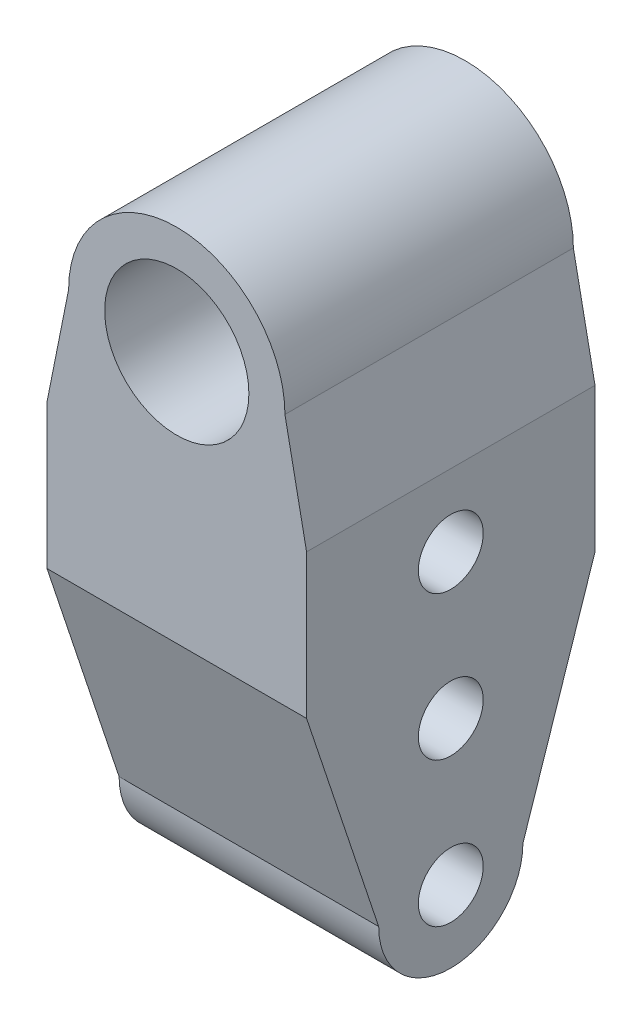
ISO-10303-21;
HEADER;
FILE_DESCRIPTION(('STEP AP214'),'2;1');
FILE_NAME('part.step','',(''),(''),'','','');
FILE_SCHEMA(('AUTOMOTIVE_DESIGN { 1 0 10303 214 1 1 1 1 }'));
ENDSEC;
DATA;
#1=APPLICATION_CONTEXT('core data for automotive mechanical design processes');
#2=APPLICATION_PROTOCOL_DEFINITION('international standard','automotive_design',2000,#1);
#3=PRODUCT_CONTEXT('',#1,'mechanical');
#4=PRODUCT('Part','Part','',(#3));
#5=PRODUCT_RELATED_PRODUCT_CATEGORY('part','',(#4));
#6=PRODUCT_DEFINITION_FORMATION('','',#4);
#7=PRODUCT_DEFINITION_CONTEXT('part definition',#1,'design');
#8=PRODUCT_DEFINITION('design','',#6,#7);
#9=PRODUCT_DEFINITION_SHAPE('','',#8);
#10=(LENGTH_UNIT() NAMED_UNIT(*) SI_UNIT(.MILLI.,.METRE.));
#11=(NAMED_UNIT(*) PLANE_ANGLE_UNIT() SI_UNIT($,.RADIAN.));
#12=(NAMED_UNIT(*) SI_UNIT($,.STERADIAN.) SOLID_ANGLE_UNIT());
#13=UNCERTAINTY_MEASURE_WITH_UNIT(LENGTH_MEASURE(1.E-05),#10,'distance_accuracy_value','');
#14=(GEOMETRIC_REPRESENTATION_CONTEXT(3) GLOBAL_UNCERTAINTY_ASSIGNED_CONTEXT((#13)) GLOBAL_UNIT_ASSIGNED_CONTEXT((#10,
#11,#12)) REPRESENTATION_CONTEXT('',''));
#15=CARTESIAN_POINT('',(0.,0.,0.));
#16=DIRECTION('',(0.,0.,1.));
#17=DIRECTION('',(1.,0.,0.));
#18=AXIS2_PLACEMENT_3D('',#15,#16,#17);
#19=CARTESIAN_POINT('',(18.,-75.,20.));
#20=DIRECTION('',(-1.,0.,0.));
#21=DIRECTION('',(0.,-1.,0.));
#22=AXIS2_PLACEMENT_3D('',#19,#20,#21);
#23=PLANE('',#22);
#24=CARTESIAN_POINT('',(18.,-25.,0.));
#25=DIRECTION('',(-1.,0.,0.));
#26=DIRECTION('',(0.,-1.,0.));
#27=AXIS2_PLACEMENT_3D('',#24,#25,#26);
#28=CIRCLE('',#27,4.5);
#29=CARTESIAN_POINT('',(18.,-29.5,0.));
#30=VERTEX_POINT('',#29);
#31=EDGE_CURVE('E136',#30,#30,#28,.T.);
#32=ORIENTED_EDGE('',*,*,#31,.T.);
#33=EDGE_LOOP('',(#32));
#34=FACE_BOUND('',#33,.T.);
#35=CARTESIAN_POINT('',(18.,-45.,0.));
#36=DIRECTION('',(-1.,0.,0.));
#37=DIRECTION('',(0.,-1.,0.));
#38=AXIS2_PLACEMENT_3D('',#35,#36,#37);
#39=CIRCLE('',#38,4.5);
#40=CARTESIAN_POINT('',(18.,-49.5,0.));
#41=VERTEX_POINT('',#40);
#42=EDGE_CURVE('E137',#41,#41,#39,.T.);
#43=ORIENTED_EDGE('',*,*,#42,.T.);
#44=EDGE_LOOP('',(#43));
#45=FACE_BOUND('',#44,.T.);
#46=CARTESIAN_POINT('',(18.,-65.,0.));
#47=DIRECTION('',(-1.,0.,0.));
#48=DIRECTION('',(0.,-1.,0.));
#49=AXIS2_PLACEMENT_3D('',#46,#47,#48);
#50=CIRCLE('',#49,4.5);
#51=CARTESIAN_POINT('',(18.,-69.5,0.));
#52=VERTEX_POINT('',#51);
#53=EDGE_CURVE('E141',#52,#52,#50,.T.);
#54=ORIENTED_EDGE('',*,*,#53,.T.);
#55=EDGE_LOOP('',(#54));
#56=FACE_BOUND('',#55,.T.);
#57=DIRECTION('',(0.,0.948683298050514,0.316227766016838));
#58=VECTOR('',#57,1.);
#59=CARTESIAN_POINT('',(18.,-71.,8.));
#60=LINE('',#59,#58);
#61=CARTESIAN_POINT('',(18.,-65.,10.));
#62=VERTEX_POINT('',#61);
#63=CARTESIAN_POINT('',(18.,-35.,20.));
#64=VERTEX_POINT('',#63);
#65=EDGE_CURVE('E144',#62,#64,#60,.T.);
#66=ORIENTED_EDGE('',*,*,#65,.F.);
#67=CARTESIAN_POINT('',(18.,-65.,0.));
#68=DIRECTION('',(-1.,0.,0.));
#69=DIRECTION('',(0.,-1.,0.));
#70=AXIS2_PLACEMENT_3D('',#67,#68,#69);
#71=CIRCLE('',#70,10.);
#72=CARTESIAN_POINT('',(18.,-65.0000000000001,-9.99999999999999));
#73=VERTEX_POINT('',#72);
#74=EDGE_CURVE('E52',#73,#62,#71,.T.);
#75=ORIENTED_EDGE('',*,*,#74,.F.);
#76=DIRECTION('',(0.,-0.948683298050514,0.316227766016838));
#77=VECTOR('',#76,1.);
#78=CARTESIAN_POINT('',(18.,-83.,-4.));
#79=LINE('',#78,#77);
#80=CARTESIAN_POINT('',(18.,-35.,-20.));
#81=VERTEX_POINT('',#80);
#82=EDGE_CURVE('E183',#81,#73,#79,.T.);
#83=ORIENTED_EDGE('',*,*,#82,.F.);
#84=DIRECTION('',(0.,1.,0.));
#85=VECTOR('',#84,1.);
#86=CARTESIAN_POINT('',(18.,-75.,-20.));
#87=LINE('',#86,#85);
#88=CARTESIAN_POINT('',(18.,-15.,-20.));
#89=VERTEX_POINT('',#88);
#90=EDGE_CURVE('E121',#81,#89,#87,.T.);
#91=ORIENTED_EDGE('',*,*,#90,.T.);
#92=DIRECTION('',(0.,0.,-1.));
#93=VECTOR('',#92,1.);
#94=CARTESIAN_POINT('',(18.,-15.,20.));
#95=LINE('',#94,#93);
#96=CARTESIAN_POINT('',(18.,-15.,20.));
#97=VERTEX_POINT('',#96);
#98=EDGE_CURVE('E127',#97,#89,#95,.T.);
#99=ORIENTED_EDGE('',*,*,#98,.F.);
#100=DIRECTION('',(0.,1.,0.));
#101=VECTOR('',#100,1.);
#102=CARTESIAN_POINT('',(18.,-75.,20.));
#103=LINE('',#102,#101);
#104=EDGE_CURVE('E112',#64,#97,#103,.T.);
#105=ORIENTED_EDGE('',*,*,#104,.F.);
#106=EDGE_LOOP('',(#66,#75,#83,#91,#99,#105));
#107=FACE_BOUND('',#106,.T.);
#108=ADVANCED_FACE('F38',(#34,#45,#56,#107),#23,.F.);
#109=CARTESIAN_POINT('',(-18.,-75.,20.));
#110=DIRECTION('',(1.,0.,0.));
#111=DIRECTION('',(0.,0.,-1.));
#112=AXIS2_PLACEMENT_3D('',#109,#110,#111);
#113=PLANE('',#112);
#114=CARTESIAN_POINT('',(-18.,-25.,0.));
#115=DIRECTION('',(1.,0.,0.));
#116=DIRECTION('',(0.,0.,-1.));
#117=AXIS2_PLACEMENT_3D('',#114,#115,#116);
#118=CIRCLE('',#117,4.5);
#119=CARTESIAN_POINT('',(-18.,-25.,-4.5));
#120=VERTEX_POINT('',#119);
#121=EDGE_CURVE('E133',#120,#120,#118,.T.);
#122=ORIENTED_EDGE('',*,*,#121,.T.);
#123=EDGE_LOOP('',(#122));
#124=FACE_BOUND('',#123,.T.);
#125=CARTESIAN_POINT('',(-18.,-45.,0.));
#126=DIRECTION('',(1.,0.,0.));
#127=DIRECTION('',(0.,0.,-1.));
#128=AXIS2_PLACEMENT_3D('',#125,#126,#127);
#129=CIRCLE('',#128,4.5);
#130=CARTESIAN_POINT('',(-18.,-45.,-4.5));
#131=VERTEX_POINT('',#130);
#132=EDGE_CURVE('E138',#131,#131,#129,.T.);
#133=ORIENTED_EDGE('',*,*,#132,.T.);
#134=EDGE_LOOP('',(#133));
#135=FACE_BOUND('',#134,.T.);
#136=CARTESIAN_POINT('',(-18.,-65.,0.));
#137=DIRECTION('',(1.,0.,0.));
#138=DIRECTION('',(0.,0.,-1.));
#139=AXIS2_PLACEMENT_3D('',#136,#137,#138);
#140=CIRCLE('',#139,4.5);
#141=CARTESIAN_POINT('',(-18.,-65.,-4.5));
#142=VERTEX_POINT('',#141);
#143=EDGE_CURVE('E142',#142,#142,#140,.T.);
#144=ORIENTED_EDGE('',*,*,#143,.T.);
#145=EDGE_LOOP('',(#144));
#146=FACE_BOUND('',#145,.T.);
#147=DIRECTION('',(0.,-0.948683298050514,-0.316227766016838));
#148=VECTOR('',#147,1.);
#149=CARTESIAN_POINT('',(-18.,-71.,8.));
#150=LINE('',#149,#148);
#151=CARTESIAN_POINT('',(-18.,-35.,20.));
#152=VERTEX_POINT('',#151);
#153=CARTESIAN_POINT('',(-18.,-65.,10.));
#154=VERTEX_POINT('',#153);
#155=EDGE_CURVE('E11',#152,#154,#150,.T.);
#156=ORIENTED_EDGE('',*,*,#155,.F.);
#157=DIRECTION('',(0.,-1.,0.));
#158=VECTOR('',#157,1.);
#159=CARTESIAN_POINT('',(-18.,-75.,20.));
#160=LINE('',#159,#158);
#161=CARTESIAN_POINT('',(-18.,-15.,20.));
#162=VERTEX_POINT('',#161);
#163=EDGE_CURVE('E151',#162,#152,#160,.T.);
#164=ORIENTED_EDGE('',*,*,#163,.F.);
#165=DIRECTION('',(0.,0.,-1.));
#166=VECTOR('',#165,1.);
#167=CARTESIAN_POINT('',(-18.,-15.,20.));
#168=LINE('',#167,#166);
#169=CARTESIAN_POINT('',(-18.,-15.,-20.));
#170=VERTEX_POINT('',#169);
#171=EDGE_CURVE('E109',#162,#170,#168,.T.);
#172=ORIENTED_EDGE('',*,*,#171,.T.);
#173=DIRECTION('',(0.,-1.,0.));
#174=VECTOR('',#173,1.);
#175=CARTESIAN_POINT('',(-18.,-75.,-20.));
#176=LINE('',#175,#174);
#177=CARTESIAN_POINT('',(-18.,-35.,-20.));
#178=VERTEX_POINT('',#177);
#179=EDGE_CURVE('E101',#170,#178,#176,.T.);
#180=ORIENTED_EDGE('',*,*,#179,.T.);
#181=DIRECTION('',(0.,0.948683298050514,-0.316227766016838));
#182=VECTOR('',#181,1.);
#183=CARTESIAN_POINT('',(-18.,-83.,-4.));
#184=LINE('',#183,#182);
#185=CARTESIAN_POINT('',(-18.,-65.0000000000001,-9.99999999999999));
#186=VERTEX_POINT('',#185);
#187=EDGE_CURVE('E105',#186,#178,#184,.T.);
#188=ORIENTED_EDGE('',*,*,#187,.F.);
#189=CARTESIAN_POINT('',(-18.,-65.,0.));
#190=DIRECTION('',(1.,0.,0.));
#191=DIRECTION('',(0.,0.,-1.));
#192=AXIS2_PLACEMENT_3D('',#189,#190,#191);
#193=CIRCLE('',#192,10.);
#194=EDGE_CURVE('E45',#154,#186,#193,.T.);
#195=ORIENTED_EDGE('',*,*,#194,.F.);
#196=EDGE_LOOP('',(#156,#164,#172,#180,#188,#195));
#197=FACE_BOUND('',#196,.T.);
#198=ADVANCED_FACE('F103',(#124,#135,#146,#197),#113,.F.);
#199=CARTESIAN_POINT('',(0.,0.,20.));
#200=DIRECTION('',(0.,0.,1.));
#201=DIRECTION('',(1.,0.,0.));
#202=AXIS2_PLACEMENT_3D('',#199,#200,#201);
#203=PLANE('',#202);
#204=DIRECTION('',(-1.,0.,0.));
#205=VECTOR('',#204,1.);
#206=CARTESIAN_POINT('',(149.077267289183,-35.,20.));
#207=LINE('',#206,#205);
#208=EDGE_CURVE('E185',#64,#152,#207,.T.);
#209=ORIENTED_EDGE('',*,*,#208,.F.);
#210=ORIENTED_EDGE('',*,*,#104,.T.);
#211=DIRECTION('',(-0.196116135138184,0.98058067569092,0.));
#212=VECTOR('',#211,1.);
#213=CARTESIAN_POINT('',(18.,-15.,20.));
#214=LINE('',#213,#212);
#215=CARTESIAN_POINT('',(15.,0.,20.));
#216=VERTEX_POINT('',#215);
#217=EDGE_CURVE('E166',#97,#216,#214,.T.);
#218=ORIENTED_EDGE('',*,*,#217,.T.);
#219=CARTESIAN_POINT('',(0.,0.,20.));
#220=DIRECTION('',(0.,0.,1.));
#221=DIRECTION('',(1.,0.,0.));
#222=AXIS2_PLACEMENT_3D('',#219,#220,#221);
#223=CIRCLE('',#222,15.);
#224=CARTESIAN_POINT('',(-15.,0.,20.));
#225=VERTEX_POINT('',#224);
#226=EDGE_CURVE('E164',#216,#225,#223,.T.);
#227=ORIENTED_EDGE('',*,*,#226,.T.);
#228=DIRECTION('',(-0.196116135138184,-0.98058067569092,0.));
#229=VECTOR('',#228,1.);
#230=CARTESIAN_POINT('',(-18.,-15.,20.));
#231=LINE('',#230,#229);
#232=EDGE_CURVE('E162',#225,#162,#231,.T.);
#233=ORIENTED_EDGE('',*,*,#232,.T.);
#234=ORIENTED_EDGE('',*,*,#163,.T.);
#235=EDGE_LOOP('',(#209,#210,#218,#227,#233,#234));
#236=FACE_BOUND('',#235,.T.);
#237=CARTESIAN_POINT('',(0.,0.,20.));
#238=DIRECTION('',(0.,0.,1.));
#239=DIRECTION('',(1.,0.,0.));
#240=AXIS2_PLACEMENT_3D('',#237,#238,#239);
#241=CIRCLE('',#240,10.);
#242=CARTESIAN_POINT('',(10.,0.,20.));
#243=VERTEX_POINT('',#242);
#244=EDGE_CURVE('E159',#243,#243,#241,.T.);
#245=ORIENTED_EDGE('',*,*,#244,.F.);
#246=EDGE_LOOP('',(#245));
#247=FACE_BOUND('',#246,.T.);
#248=ADVANCED_FACE('F195',(#236,#247),#203,.T.);
#249=CARTESIAN_POINT('',(0.,0.,-20.));
#250=DIRECTION('',(0.,0.,1.));
#251=DIRECTION('',(1.,0.,0.));
#252=AXIS2_PLACEMENT_3D('',#249,#250,#251);
#253=PLANE('',#252);
#254=ORIENTED_EDGE('',*,*,#90,.F.);
#255=DIRECTION('',(-1.,0.,0.));
#256=VECTOR('',#255,1.);
#257=CARTESIAN_POINT('',(149.077267289183,-35.,-20.));
#258=LINE('',#257,#256);
#259=EDGE_CURVE('E117',#81,#178,#258,.T.);
#260=ORIENTED_EDGE('',*,*,#259,.T.);
#261=ORIENTED_EDGE('',*,*,#179,.F.);
#262=DIRECTION('',(-0.196116135138184,-0.98058067569092,0.));
#263=VECTOR('',#262,1.);
#264=CARTESIAN_POINT('',(-18.,-15.,-20.));
#265=LINE('',#264,#263);
#266=CARTESIAN_POINT('',(-15.,0.,-20.));
#267=VERTEX_POINT('',#266);
#268=EDGE_CURVE('E113',#267,#170,#265,.T.);
#269=ORIENTED_EDGE('',*,*,#268,.F.);
#270=CARTESIAN_POINT('',(0.,0.,-20.));
#271=DIRECTION('',(0.,0.,1.));
#272=DIRECTION('',(1.,0.,0.));
#273=AXIS2_PLACEMENT_3D('',#270,#271,#272);
#274=CIRCLE('',#273,15.);
#275=CARTESIAN_POINT('',(15.,0.,-20.));
#276=VERTEX_POINT('',#275);
#277=EDGE_CURVE('E154',#276,#267,#274,.T.);
#278=ORIENTED_EDGE('',*,*,#277,.F.);
#279=DIRECTION('',(-0.196116135138184,0.98058067569092,0.));
#280=VECTOR('',#279,1.);
#281=CARTESIAN_POINT('',(18.,-15.,-20.));
#282=LINE('',#281,#280);
#283=EDGE_CURVE('E156',#89,#276,#282,.T.);
#284=ORIENTED_EDGE('',*,*,#283,.F.);
#285=EDGE_LOOP('',(#254,#260,#261,#269,#278,#284));
#286=FACE_BOUND('',#285,.T.);
#287=CARTESIAN_POINT('',(0.,0.,-20.));
#288=DIRECTION('',(0.,0.,1.));
#289=DIRECTION('',(1.,0.,0.));
#290=AXIS2_PLACEMENT_3D('',#287,#288,#289);
#291=CIRCLE('',#290,10.);
#292=CARTESIAN_POINT('',(10.,0.,-20.));
#293=VERTEX_POINT('',#292);
#294=EDGE_CURVE('E169',#293,#293,#291,.T.);
#295=ORIENTED_EDGE('',*,*,#294,.T.);
#296=EDGE_LOOP('',(#295));
#297=FACE_BOUND('',#296,.T.);
#298=ADVANCED_FACE('F118',(#286,#297),#253,.F.);
#299=CARTESIAN_POINT('',(18.,-15.,20.));
#300=DIRECTION('',(-0.98058067569092,-0.196116135138184,0.));
#301=DIRECTION('',(0.196116135138184,-0.98058067569092,0.));
#302=AXIS2_PLACEMENT_3D('',#299,#300,#301);
#303=PLANE('',#302);
#304=ORIENTED_EDGE('',*,*,#283,.T.);
#305=DIRECTION('',(0.,0.,-1.));
#306=VECTOR('',#305,1.);
#307=CARTESIAN_POINT('',(15.,0.,20.));
#308=LINE('',#307,#306);
#309=EDGE_CURVE('E130',#216,#276,#308,.T.);
#310=ORIENTED_EDGE('',*,*,#309,.F.);
#311=ORIENTED_EDGE('',*,*,#217,.F.);
#312=ORIENTED_EDGE('',*,*,#98,.T.);
#313=EDGE_LOOP('',(#304,#310,#311,#312));
#314=FACE_BOUND('',#313,.T.);
#315=ADVANCED_FACE('F209',(#314),#303,.F.);
#316=CARTESIAN_POINT('',(0.,0.,20.));
#317=DIRECTION('',(0.,0.,-1.));
#318=DIRECTION('',(-1.,0.,0.));
#319=AXIS2_PLACEMENT_3D('',#316,#317,#318);
#320=CYLINDRICAL_SURFACE('',#319,15.);
#321=ORIENTED_EDGE('',*,*,#277,.T.);
#322=DIRECTION('',(0.,0.,-1.));
#323=VECTOR('',#322,1.);
#324=CARTESIAN_POINT('',(-15.,0.,20.));
#325=LINE('',#324,#323);
#326=EDGE_CURVE('E148',#225,#267,#325,.T.);
#327=ORIENTED_EDGE('',*,*,#326,.F.);
#328=ORIENTED_EDGE('',*,*,#226,.F.);
#329=ORIENTED_EDGE('',*,*,#309,.T.);
#330=EDGE_LOOP('',(#321,#327,#328,#329));
#331=FACE_BOUND('',#330,.T.);
#332=ADVANCED_FACE('F205',(#331),#320,.T.);
#333=CARTESIAN_POINT('',(-18.,-15.,20.));
#334=DIRECTION('',(0.98058067569092,-0.196116135138184,0.));
#335=DIRECTION('',(0.196116135138184,0.98058067569092,0.));
#336=AXIS2_PLACEMENT_3D('',#333,#334,#335);
#337=PLANE('',#336);
#338=ORIENTED_EDGE('',*,*,#268,.T.);
#339=ORIENTED_EDGE('',*,*,#171,.F.);
#340=ORIENTED_EDGE('',*,*,#232,.F.);
#341=ORIENTED_EDGE('',*,*,#326,.T.);
#342=EDGE_LOOP('',(#338,#339,#340,#341));
#343=FACE_BOUND('',#342,.T.);
#344=ADVANCED_FACE('F202',(#343),#337,.F.);
#345=CARTESIAN_POINT('',(0.,0.,20.));
#346=DIRECTION('',(0.,0.,-1.));
#347=DIRECTION('',(-1.,0.,0.));
#348=AXIS2_PLACEMENT_3D('',#345,#346,#347);
#349=CYLINDRICAL_SURFACE('',#348,10.);
#350=ORIENTED_EDGE('',*,*,#244,.T.);
#351=EDGE_LOOP('',(#350));
#352=FACE_BOUND('',#351,.T.);
#353=ORIENTED_EDGE('',*,*,#294,.F.);
#354=EDGE_LOOP('',(#353));
#355=FACE_BOUND('',#354,.T.);
#356=ADVANCED_FACE('F227',(#352,#355),#349,.F.);
#357=CARTESIAN_POINT('',(-20.,-65.,0.));
#358=DIRECTION('',(1.,0.,0.));
#359=DIRECTION('',(0.,0.,-1.));
#360=AXIS2_PLACEMENT_3D('',#357,#358,#359);
#361=CYLINDRICAL_SURFACE('',#360,4.5);
#362=ORIENTED_EDGE('',*,*,#143,.F.);
#363=EDGE_LOOP('',(#362));
#364=FACE_BOUND('',#363,.T.);
#365=ORIENTED_EDGE('',*,*,#53,.F.);
#366=EDGE_LOOP('',(#365));
#367=FACE_BOUND('',#366,.T.);
#368=ADVANCED_FACE('F224',(#364,#367),#361,.F.);
#369=CARTESIAN_POINT('',(-20.,-45.,0.));
#370=DIRECTION('',(1.,0.,0.));
#371=DIRECTION('',(0.,0.,-1.));
#372=AXIS2_PLACEMENT_3D('',#369,#370,#371);
#373=CYLINDRICAL_SURFACE('',#372,4.5);
#374=ORIENTED_EDGE('',*,*,#132,.F.);
#375=EDGE_LOOP('',(#374));
#376=FACE_BOUND('',#375,.T.);
#377=ORIENTED_EDGE('',*,*,#42,.F.);
#378=EDGE_LOOP('',(#377));
#379=FACE_BOUND('',#378,.T.);
#380=ADVANCED_FACE('F226',(#376,#379),#373,.F.);
#381=CARTESIAN_POINT('',(-20.,-25.,0.));
#382=DIRECTION('',(1.,0.,0.));
#383=DIRECTION('',(0.,0.,-1.));
#384=AXIS2_PLACEMENT_3D('',#381,#382,#383);
#385=CYLINDRICAL_SURFACE('',#384,4.5);
#386=ORIENTED_EDGE('',*,*,#121,.F.);
#387=EDGE_LOOP('',(#386));
#388=FACE_BOUND('',#387,.T.);
#389=ORIENTED_EDGE('',*,*,#31,.F.);
#390=EDGE_LOOP('',(#389));
#391=FACE_BOUND('',#390,.T.);
#392=ADVANCED_FACE('F234',(#388,#391),#385,.F.);
#393=CARTESIAN_POINT('',(149.077267289183,-35.,20.));
#394=DIRECTION('',(0.,-0.316227766016838,0.948683298050514));
#395=DIRECTION('',(0.,-0.948683298050514,-0.316227766016838));
#396=AXIS2_PLACEMENT_3D('',#393,#394,#395);
#397=PLANE('',#396);
#398=DIRECTION('',(-1.,0.,0.));
#399=VECTOR('',#398,1.);
#400=CARTESIAN_POINT('',(149.077267289183,-65.,10.));
#401=LINE('',#400,#399);
#402=EDGE_CURVE('E188',#62,#154,#401,.T.);
#403=ORIENTED_EDGE('',*,*,#402,.F.);
#404=ORIENTED_EDGE('',*,*,#65,.T.);
#405=ORIENTED_EDGE('',*,*,#208,.T.);
#406=ORIENTED_EDGE('',*,*,#155,.T.);
#407=EDGE_LOOP('',(#403,#404,#405,#406));
#408=FACE_BOUND('',#407,.T.);
#409=ADVANCED_FACE('F193',(#408),#397,.T.);
#410=CARTESIAN_POINT('',(149.077267289183,-65.,0.));
#411=DIRECTION('',(-1.,0.,0.));
#412=DIRECTION('',(0.,-1.,0.));
#413=AXIS2_PLACEMENT_3D('',#410,#411,#412);
#414=CYLINDRICAL_SURFACE('',#413,10.);
#415=ORIENTED_EDGE('',*,*,#74,.T.);
#416=ORIENTED_EDGE('',*,*,#402,.T.);
#417=ORIENTED_EDGE('',*,*,#194,.T.);
#418=DIRECTION('',(-1.,0.,0.));
#419=VECTOR('',#418,1.);
#420=CARTESIAN_POINT('',(149.077267289183,-65.,-10.));
#421=LINE('',#420,#419);
#422=EDGE_CURVE('E123',#73,#186,#421,.T.);
#423=ORIENTED_EDGE('',*,*,#422,.F.);
#424=EDGE_LOOP('',(#415,#416,#417,#423));
#425=FACE_BOUND('',#424,.T.);
#426=ADVANCED_FACE('F191',(#425),#414,.T.);
#427=CARTESIAN_POINT('',(149.077267289183,-35.,-20.));
#428=DIRECTION('',(0.,-0.316227766016838,-0.948683298050514));
#429=DIRECTION('',(0.,0.948683298050514,-0.316227766016838));
#430=AXIS2_PLACEMENT_3D('',#427,#428,#429);
#431=PLANE('',#430);
#432=ORIENTED_EDGE('',*,*,#259,.F.);
#433=ORIENTED_EDGE('',*,*,#82,.T.);
#434=ORIENTED_EDGE('',*,*,#422,.T.);
#435=ORIENTED_EDGE('',*,*,#187,.T.);
#436=EDGE_LOOP('',(#432,#433,#434,#435));
#437=FACE_BOUND('',#436,.T.);
#438=ADVANCED_FACE('F126',(#437),#431,.T.);
#439=CLOSED_SHELL('',(#108,#198,#248,#298,#315,#332,#344,#356,#368,#380,#392,#409,#426,#438));
#440=MANIFOLD_SOLID_BREP('B2',#439);
#441=ADVANCED_BREP_SHAPE_REPRESENTATION('',(#18,#440),#14);
#442=SHAPE_DEFINITION_REPRESENTATION(#9,#441);
ENDSEC;
END-ISO-10303-21;
